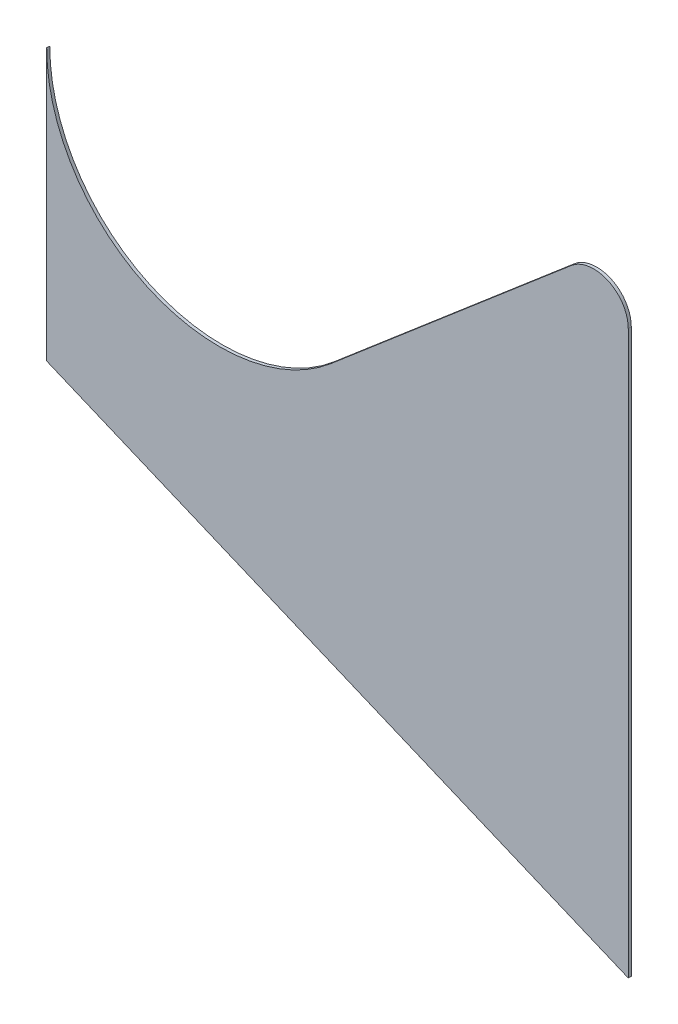
ISO-10303-21;
HEADER;
FILE_DESCRIPTION(('STEP AP214'),'2;1');
FILE_NAME('part.step','',(''),(''),'','','');
FILE_SCHEMA(('AUTOMOTIVE_DESIGN { 1 0 10303 214 1 1 1 1 }'));
ENDSEC;
DATA;
#1=APPLICATION_CONTEXT('core data for automotive mechanical design processes');
#2=APPLICATION_PROTOCOL_DEFINITION('international standard','automotive_design',2000,#1);
#3=PRODUCT_CONTEXT('',#1,'mechanical');
#4=PRODUCT('Part','Part','',(#3));
#5=PRODUCT_RELATED_PRODUCT_CATEGORY('part','',(#4));
#6=PRODUCT_DEFINITION_FORMATION('','',#4);
#7=PRODUCT_DEFINITION_CONTEXT('part definition',#1,'design');
#8=PRODUCT_DEFINITION('design','',#6,#7);
#9=PRODUCT_DEFINITION_SHAPE('','',#8);
#10=(LENGTH_UNIT() NAMED_UNIT(*) SI_UNIT(.MILLI.,.METRE.));
#11=(NAMED_UNIT(*) PLANE_ANGLE_UNIT() SI_UNIT($,.RADIAN.));
#12=(NAMED_UNIT(*) SI_UNIT($,.STERADIAN.) SOLID_ANGLE_UNIT());
#13=UNCERTAINTY_MEASURE_WITH_UNIT(LENGTH_MEASURE(1.E-05),#10,'distance_accuracy_value','');
#14=(GEOMETRIC_REPRESENTATION_CONTEXT(3) GLOBAL_UNCERTAINTY_ASSIGNED_CONTEXT((#13)) GLOBAL_UNIT_ASSIGNED_CONTEXT((#10,
#11,#12)) REPRESENTATION_CONTEXT('',''));
#15=CARTESIAN_POINT('',(0.,0.,0.));
#16=DIRECTION('',(0.,0.,1.));
#17=DIRECTION('',(1.,0.,0.));
#18=AXIS2_PLACEMENT_3D('',#15,#16,#17);
#19=CARTESIAN_POINT('',(2.709367730433,-1.728145299372,0.));
#20=DIRECTION('',(0.,0.,1.));
#21=DIRECTION('',(1.,0.,0.));
#22=AXIS2_PLACEMENT_3D('',#19,#20,#21);
#23=CYLINDRICAL_SURFACE('',#22,0.0340000000000001);
#24=CARTESIAN_POINT('',(2.709367730433,-1.728145299372,0.));
#25=DIRECTION('',(0.,0.,1.));
#26=DIRECTION('',(1.,0.,0.));
#27=AXIS2_PLACEMENT_3D('',#24,#25,#26);
#28=CIRCLE('',#27,0.0340000000000001);
#29=CARTESIAN_POINT('',(2.743367730433,-1.728145299372,0.));
#30=VERTEX_POINT('',#29);
#31=CARTESIAN_POINT('',(2.687295955204,-1.702283421285,0.));
#32=VERTEX_POINT('',#31);
#33=EDGE_CURVE('E11',#30,#32,#28,.T.);
#34=ORIENTED_EDGE('',*,*,#33,.T.);
#35=DIRECTION('',(0.,0.,1.));
#36=VECTOR('',#35,1.);
#37=CARTESIAN_POINT('',(2.687295955204,-1.702283421285,0.));
#38=LINE('',#37,#36);
#39=CARTESIAN_POINT('',(2.687295955204,-1.702283421285,0.003));
#40=VERTEX_POINT('',#39);
#41=EDGE_CURVE('E24',#32,#40,#38,.T.);
#42=ORIENTED_EDGE('',*,*,#41,.T.);
#43=CARTESIAN_POINT('',(2.709367730433,-1.728145299372,0.003));
#44=DIRECTION('',(0.,0.,1.));
#45=DIRECTION('',(1.,0.,0.));
#46=AXIS2_PLACEMENT_3D('',#43,#44,#45);
#47=CIRCLE('',#46,0.0340000000000001);
#48=CARTESIAN_POINT('',(2.743367730433,-1.728145299372,0.003));
#49=VERTEX_POINT('',#48);
#50=EDGE_CURVE('E88',#49,#40,#47,.T.);
#51=ORIENTED_EDGE('',*,*,#50,.F.);
#52=DIRECTION('',(0.,0.,1.));
#53=VECTOR('',#52,1.);
#54=CARTESIAN_POINT('',(2.743367730433,-1.728145299372,0.));
#55=LINE('',#54,#53);
#56=EDGE_CURVE('E116',#30,#49,#55,.T.);
#57=ORIENTED_EDGE('',*,*,#56,.F.);
#58=EDGE_LOOP('',(#34,#42,#51,#57));
#59=FACE_BOUND('',#58,.T.);
#60=ADVANCED_FACE('F17',(#59),#23,.T.);
#61=CARTESIAN_POINT('',(2.743367730433,-2.282421263641,0.));
#62=DIRECTION('',(1.,0.,0.));
#63=DIRECTION('',(0.,1.,0.));
#64=AXIS2_PLACEMENT_3D('',#61,#62,#63);
#65=PLANE('',#64);
#66=DIRECTION('',(0.,1.,0.));
#67=VECTOR('',#66,1.);
#68=CARTESIAN_POINT('',(2.743367730433,-2.282421263641,0.));
#69=LINE('',#68,#67);
#70=CARTESIAN_POINT('',(2.743367730433,-2.282421263641,0.));
#71=VERTEX_POINT('',#70);
#72=EDGE_CURVE('E113',#71,#30,#69,.T.);
#73=ORIENTED_EDGE('',*,*,#72,.T.);
#74=ORIENTED_EDGE('',*,*,#56,.T.);
#75=DIRECTION('',(0.,1.,0.));
#76=VECTOR('',#75,1.);
#77=CARTESIAN_POINT('',(2.743367730433,-2.282421263641,0.003));
#78=LINE('',#77,#76);
#79=CARTESIAN_POINT('',(2.743367730433,-2.282421263641,0.003));
#80=VERTEX_POINT('',#79);
#81=EDGE_CURVE('E111',#80,#49,#78,.T.);
#82=ORIENTED_EDGE('',*,*,#81,.F.);
#83=DIRECTION('',(0.,0.,1.));
#84=VECTOR('',#83,1.);
#85=CARTESIAN_POINT('',(2.743367730433,-2.282421263641,0.));
#86=LINE('',#85,#84);
#87=EDGE_CURVE('E108',#71,#80,#86,.T.);
#88=ORIENTED_EDGE('',*,*,#87,.F.);
#89=EDGE_LOOP('',(#73,#74,#82,#88));
#90=FACE_BOUND('',#89,.T.);
#91=ADVANCED_FACE('F127',(#90),#65,.T.);
#92=CARTESIAN_POINT('',(2.170196909422,-2.042436460162,0.));
#93=DIRECTION('',(-0.386210432787202,-0.922410701155577,0.));
#94=DIRECTION('',(0.922410701155577,-0.386210432787202,0.));
#95=AXIS2_PLACEMENT_3D('',#92,#93,#94);
#96=PLANE('',#95);
#97=DIRECTION('',(0.922410701155577,-0.386210432787201,0.));
#98=VECTOR('',#97,1.);
#99=CARTESIAN_POINT('',(2.170196909422,-2.042436460162,0.));
#100=LINE('',#99,#98);
#101=CARTESIAN_POINT('',(2.170196909422,-2.042436460162,0.));
#102=VERTEX_POINT('',#101);
#103=EDGE_CURVE('E105',#102,#71,#100,.T.);
#104=ORIENTED_EDGE('',*,*,#103,.T.);
#105=ORIENTED_EDGE('',*,*,#87,.T.);
#106=DIRECTION('',(0.922410701155577,-0.386210432787201,0.));
#107=VECTOR('',#106,1.);
#108=CARTESIAN_POINT('',(2.170196909422,-2.042436460162,0.003));
#109=LINE('',#108,#107);
#110=CARTESIAN_POINT('',(2.170196909422,-2.042436460162,0.003));
#111=VERTEX_POINT('',#110);
#112=EDGE_CURVE('E102',#111,#80,#109,.T.);
#113=ORIENTED_EDGE('',*,*,#112,.F.);
#114=DIRECTION('',(0.,0.,1.));
#115=VECTOR('',#114,1.);
#116=CARTESIAN_POINT('',(2.170196909422,-2.042436460162,0.));
#117=LINE('',#116,#115);
#118=EDGE_CURVE('E99',#102,#111,#117,.T.);
#119=ORIENTED_EDGE('',*,*,#118,.F.);
#120=EDGE_LOOP('',(#104,#105,#113,#119));
#121=FACE_BOUND('',#120,.T.);
#122=ADVANCED_FACE('F124',(#121),#96,.T.);
#123=CARTESIAN_POINT('',(2.170196909422,-1.775019520125,0.));
#124=DIRECTION('',(-1.,0.,0.));
#125=DIRECTION('',(0.,-1.,0.));
#126=AXIS2_PLACEMENT_3D('',#123,#124,#125);
#127=PLANE('',#126);
#128=DIRECTION('',(0.,-1.,0.));
#129=VECTOR('',#128,1.);
#130=CARTESIAN_POINT('',(2.170196909422,-1.775019520125,0.));
#131=LINE('',#130,#129);
#132=CARTESIAN_POINT('',(2.170196909422,-1.775019520125,0.));
#133=VERTEX_POINT('',#132);
#134=EDGE_CURVE('E96',#133,#102,#131,.T.);
#135=ORIENTED_EDGE('',*,*,#134,.T.);
#136=ORIENTED_EDGE('',*,*,#118,.T.);
#137=DIRECTION('',(0.,-1.,0.));
#138=VECTOR('',#137,1.);
#139=CARTESIAN_POINT('',(2.170196909422,-1.775019520125,0.003));
#140=LINE('',#139,#138);
#141=CARTESIAN_POINT('',(2.170196909422,-1.775019520125,0.003));
#142=VERTEX_POINT('',#141);
#143=EDGE_CURVE('E94',#142,#111,#140,.T.);
#144=ORIENTED_EDGE('',*,*,#143,.F.);
#145=DIRECTION('',(0.,0.,1.));
#146=VECTOR('',#145,1.);
#147=CARTESIAN_POINT('',(2.170196909422,-1.775019520125,0.));
#148=LINE('',#147,#146);
#149=EDGE_CURVE('E80',#133,#142,#148,.T.);
#150=ORIENTED_EDGE('',*,*,#149,.F.);
#151=EDGE_LOOP('',(#135,#136,#144,#150));
#152=FACE_BOUND('',#151,.T.);
#153=ADVANCED_FACE('F122',(#152),#127,.T.);
#154=CARTESIAN_POINT('',(2.340196909422,-1.775019520125,0.));
#155=DIRECTION('',(0.,0.,1.));
#156=DIRECTION('',(1.,0.,0.));
#157=AXIS2_PLACEMENT_3D('',#154,#155,#156);
#158=CYLINDRICAL_SURFACE('',#157,0.17);
#159=CARTESIAN_POINT('',(2.340196909422,-1.775019520125,0.));
#160=DIRECTION('',(0.,0.,-1.));
#161=DIRECTION('',(1.,0.,0.));
#162=AXIS2_PLACEMENT_3D('',#159,#160,#161);
#163=CIRCLE('',#162,0.17);
#164=CARTESIAN_POINT('',(2.450555785568,-1.904328910564,0.));
#165=VERTEX_POINT('',#164);
#166=EDGE_CURVE('E83',#165,#133,#163,.T.);
#167=ORIENTED_EDGE('',*,*,#166,.T.);
#168=ORIENTED_EDGE('',*,*,#149,.T.);
#169=CARTESIAN_POINT('',(2.340196909422,-1.775019520125,0.003));
#170=DIRECTION('',(0.,0.,-1.));
#171=DIRECTION('',(1.,0.,0.));
#172=AXIS2_PLACEMENT_3D('',#169,#170,#171);
#173=CIRCLE('',#172,0.17);
#174=CARTESIAN_POINT('',(2.450555785568,-1.904328910564,0.003));
#175=VERTEX_POINT('',#174);
#176=EDGE_CURVE('E74',#175,#142,#173,.T.);
#177=ORIENTED_EDGE('',*,*,#176,.F.);
#178=DIRECTION('',(0.,0.,1.));
#179=VECTOR('',#178,1.);
#180=CARTESIAN_POINT('',(2.450555785568,-1.904328910564,0.));
#181=LINE('',#180,#179);
#182=EDGE_CURVE('E65',#165,#175,#181,.T.);
#183=ORIENTED_EDGE('',*,*,#182,.F.);
#184=EDGE_LOOP('',(#167,#168,#177,#183));
#185=FACE_BOUND('',#184,.T.);
#186=ADVANCED_FACE('F78',(#185),#158,.F.);
#187=CARTESIAN_POINT('',(2.687295955204,-1.702283421285,0.));
#188=DIRECTION('',(-0.649169859684289,0.760643473170894,0.));
#189=DIRECTION('',(-0.760643473170894,-0.649169859684289,0.));
#190=AXIS2_PLACEMENT_3D('',#187,#188,#189);
#191=PLANE('',#190);
#192=DIRECTION('',(-0.760643473170894,-0.649169859684289,0.));
#193=VECTOR('',#192,1.);
#194=CARTESIAN_POINT('',(2.687295955204,-1.702283421285,0.));
#195=LINE('',#194,#193);
#196=EDGE_CURVE('E70',#32,#165,#195,.T.);
#197=ORIENTED_EDGE('',*,*,#196,.T.);
#198=ORIENTED_EDGE('',*,*,#182,.T.);
#199=DIRECTION('',(-0.760643473170894,-0.649169859684289,0.));
#200=VECTOR('',#199,1.);
#201=CARTESIAN_POINT('',(2.687295955204,-1.702283421285,0.003));
#202=LINE('',#201,#200);
#203=EDGE_CURVE('E69',#40,#175,#202,.T.);
#204=ORIENTED_EDGE('',*,*,#203,.F.);
#205=ORIENTED_EDGE('',*,*,#41,.F.);
#206=EDGE_LOOP('',(#197,#198,#204,#205));
#207=FACE_BOUND('',#206,.T.);
#208=ADVANCED_FACE('F67',(#207),#191,.T.);
#209=CARTESIAN_POINT('',(2.456782319927,-1.988283281507,0.003));
#210=DIRECTION('',(0.,0.,1.));
#211=DIRECTION('',(1.,0.,0.));
#212=AXIS2_PLACEMENT_3D('',#209,#210,#211);
#213=PLANE('',#212);
#214=ORIENTED_EDGE('',*,*,#203,.T.);
#215=ORIENTED_EDGE('',*,*,#176,.T.);
#216=ORIENTED_EDGE('',*,*,#143,.T.);
#217=ORIENTED_EDGE('',*,*,#112,.T.);
#218=ORIENTED_EDGE('',*,*,#81,.T.);
#219=ORIENTED_EDGE('',*,*,#50,.T.);
#220=EDGE_LOOP('',(#214,#215,#216,#217,#218,#219));
#221=FACE_BOUND('',#220,.T.);
#222=ADVANCED_FACE('F86',(#221),#213,.T.);
#223=CARTESIAN_POINT('',(2.456782319927,-1.988283281507,0.));
#224=DIRECTION('',(0.,0.,1.));
#225=DIRECTION('',(1.,0.,0.));
#226=AXIS2_PLACEMENT_3D('',#223,#224,#225);
#227=PLANE('',#226);
#228=ORIENTED_EDGE('',*,*,#196,.F.);
#229=ORIENTED_EDGE('',*,*,#33,.F.);
#230=ORIENTED_EDGE('',*,*,#72,.F.);
#231=ORIENTED_EDGE('',*,*,#103,.F.);
#232=ORIENTED_EDGE('',*,*,#134,.F.);
#233=ORIENTED_EDGE('',*,*,#166,.F.);
#234=EDGE_LOOP('',(#228,#229,#230,#231,#232,#233));
#235=FACE_BOUND('',#234,.T.);
#236=ADVANCED_FACE('F119',(#235),#227,.F.);
#237=CLOSED_SHELL('',(#60,#91,#122,#153,#186,#208,#222,#236));
#238=MANIFOLD_SOLID_BREP('B1',#237);
#239=ADVANCED_BREP_SHAPE_REPRESENTATION('',(#18,#238),#14);
#240=SHAPE_DEFINITION_REPRESENTATION(#9,#239);
ENDSEC;
END-ISO-10303-21;
